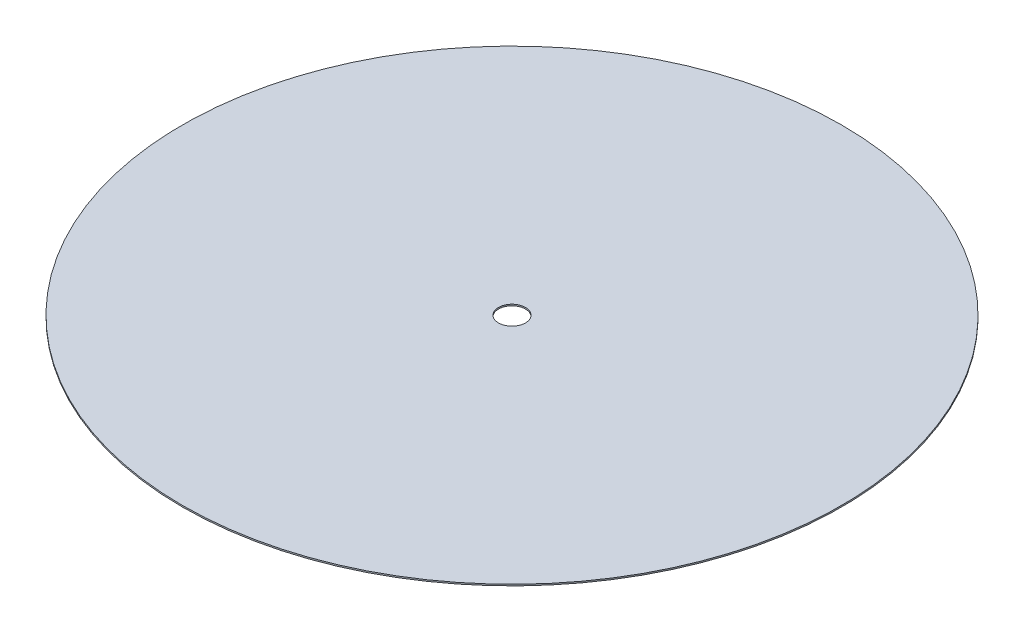
ISO-10303-21;
HEADER;
FILE_DESCRIPTION(('STEP AP214'),'2;1');
FILE_NAME('part.step','',(''),(''),'','','');
FILE_SCHEMA(('AUTOMOTIVE_DESIGN { 1 0 10303 214 1 1 1 1 }'));
ENDSEC;
DATA;
#1=APPLICATION_CONTEXT('core data for automotive mechanical design processes');
#2=APPLICATION_PROTOCOL_DEFINITION('international standard','automotive_design',2000,#1);
#3=PRODUCT_CONTEXT('',#1,'mechanical');
#4=PRODUCT('Part','Part','',(#3));
#5=PRODUCT_RELATED_PRODUCT_CATEGORY('part','',(#4));
#6=PRODUCT_DEFINITION_FORMATION('','',#4);
#7=PRODUCT_DEFINITION_CONTEXT('part definition',#1,'design');
#8=PRODUCT_DEFINITION('design','',#6,#7);
#9=PRODUCT_DEFINITION_SHAPE('','',#8);
#10=(LENGTH_UNIT() NAMED_UNIT(*) SI_UNIT(.MILLI.,.METRE.));
#11=(NAMED_UNIT(*) PLANE_ANGLE_UNIT() SI_UNIT($,.RADIAN.));
#12=(NAMED_UNIT(*) SI_UNIT($,.STERADIAN.) SOLID_ANGLE_UNIT());
#13=UNCERTAINTY_MEASURE_WITH_UNIT(LENGTH_MEASURE(1.E-05),#10,'distance_accuracy_value','');
#14=(GEOMETRIC_REPRESENTATION_CONTEXT(3) GLOBAL_UNCERTAINTY_ASSIGNED_CONTEXT((#13)) GLOBAL_UNIT_ASSIGNED_CONTEXT((#10,
#11,#12)) REPRESENTATION_CONTEXT('',''));
#15=CARTESIAN_POINT('',(0.,0.,0.));
#16=DIRECTION('',(0.,0.,1.));
#17=DIRECTION('',(1.,0.,0.));
#18=AXIS2_PLACEMENT_3D('',#15,#16,#17);
#19=CARTESIAN_POINT('',(0.,0.7,0.));
#20=DIRECTION('',(0.,-1.,0.));
#21=DIRECTION('',(0.,0.,-1.));
#22=AXIS2_PLACEMENT_3D('',#19,#20,#21);
#23=CYLINDRICAL_SURFACE('',#22,160.3375);
#24=CARTESIAN_POINT('',(0.,0.7,0.));
#25=DIRECTION('',(0.,1.,0.));
#26=DIRECTION('',(0.,0.,1.));
#27=AXIS2_PLACEMENT_3D('',#24,#25,#26);
#28=CIRCLE('',#27,160.3375);
#29=CARTESIAN_POINT('',(0.,0.7,160.3375));
#30=VERTEX_POINT('',#29);
#31=EDGE_CURVE('E10',#30,#30,#28,.T.);
#32=ORIENTED_EDGE('',*,*,#31,.F.);
#33=EDGE_LOOP('',(#32));
#34=FACE_BOUND('',#33,.T.);
#35=CARTESIAN_POINT('',(0.,0.,0.));
#36=DIRECTION('',(0.,1.,0.));
#37=DIRECTION('',(0.,0.,1.));
#38=AXIS2_PLACEMENT_3D('',#35,#36,#37);
#39=CIRCLE('',#38,160.3375);
#40=CARTESIAN_POINT('',(0.,0.,160.3375));
#41=VERTEX_POINT('',#40);
#42=EDGE_CURVE('E39',#41,#41,#39,.T.);
#43=ORIENTED_EDGE('',*,*,#42,.T.);
#44=EDGE_LOOP('',(#43));
#45=FACE_BOUND('',#44,.T.);
#46=ADVANCED_FACE('F38',(#34,#45),#23,.T.);
#47=CARTESIAN_POINT('',(0.,0.7,0.));
#48=DIRECTION('',(0.,1.,0.));
#49=DIRECTION('',(0.,0.,1.));
#50=AXIS2_PLACEMENT_3D('',#47,#48,#49);
#51=PLANE('',#50);
#52=CARTESIAN_POINT('',(0.,0.7,0.));
#53=DIRECTION('',(0.,1.,0.));
#54=DIRECTION('',(0.,0.,1.));
#55=AXIS2_PLACEMENT_3D('',#52,#53,#54);
#56=CIRCLE('',#55,6.55);
#57=CARTESIAN_POINT('',(0.,0.7,6.55));
#58=VERTEX_POINT('',#57);
#59=EDGE_CURVE('E48',#58,#58,#56,.T.);
#60=ORIENTED_EDGE('',*,*,#59,.F.);
#61=EDGE_LOOP('',(#60));
#62=FACE_BOUND('',#61,.T.);
#63=ORIENTED_EDGE('',*,*,#31,.T.);
#64=EDGE_LOOP('',(#63));
#65=FACE_BOUND('',#64,.T.);
#66=ADVANCED_FACE('F64',(#62,#65),#51,.T.);
#67=CARTESIAN_POINT('',(0.,0.,0.));
#68=DIRECTION('',(0.,1.,0.));
#69=DIRECTION('',(0.,0.,1.));
#70=AXIS2_PLACEMENT_3D('',#67,#68,#69);
#71=PLANE('',#70);
#72=CARTESIAN_POINT('',(0.,0.,0.));
#73=DIRECTION('',(0.,1.,0.));
#74=DIRECTION('',(0.,0.,1.));
#75=AXIS2_PLACEMENT_3D('',#72,#73,#74);
#76=CIRCLE('',#75,6.55);
#77=CARTESIAN_POINT('',(0.,0.,6.55));
#78=VERTEX_POINT('',#77);
#79=EDGE_CURVE('E46',#78,#78,#76,.T.);
#80=ORIENTED_EDGE('',*,*,#79,.T.);
#81=EDGE_LOOP('',(#80));
#82=FACE_BOUND('',#81,.T.);
#83=ORIENTED_EDGE('',*,*,#42,.F.);
#84=EDGE_LOOP('',(#83));
#85=FACE_BOUND('',#84,.T.);
#86=ADVANCED_FACE('F53',(#82,#85),#71,.F.);
#87=CARTESIAN_POINT('',(0.,0.,0.));
#88=DIRECTION('',(0.,1.,0.));
#89=DIRECTION('',(0.,0.,1.));
#90=AXIS2_PLACEMENT_3D('',#87,#88,#89);
#91=CYLINDRICAL_SURFACE('',#90,6.55);
#92=ORIENTED_EDGE('',*,*,#79,.F.);
#93=EDGE_LOOP('',(#92));
#94=FACE_BOUND('',#93,.T.);
#95=ORIENTED_EDGE('',*,*,#59,.T.);
#96=EDGE_LOOP('',(#95));
#97=FACE_BOUND('',#96,.T.);
#98=ADVANCED_FACE('F60',(#94,#97),#91,.F.);
#99=CLOSED_SHELL('',(#46,#66,#86,#98));
#100=MANIFOLD_SOLID_BREP('B2',#99);
#101=ADVANCED_BREP_SHAPE_REPRESENTATION('',(#18,#100),#14);
#102=SHAPE_DEFINITION_REPRESENTATION(#9,#101);
ENDSEC;
END-ISO-10303-21;
